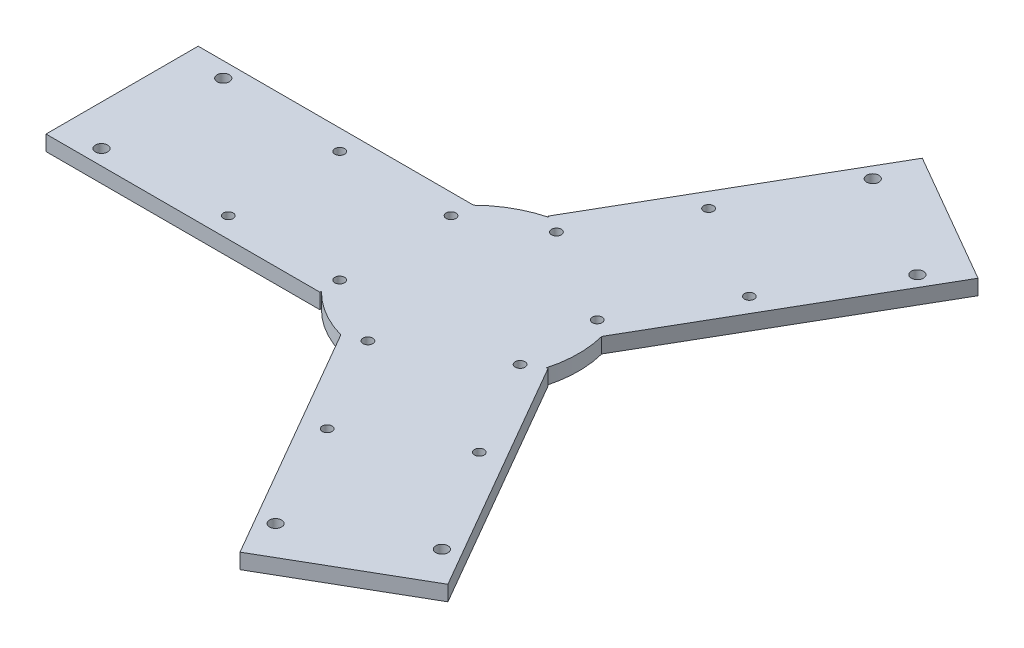
ISO-10303-21;
HEADER;
FILE_DESCRIPTION(('STEP AP214'),'2;1');
FILE_NAME('part.step','',(''),(''),'','','');
FILE_SCHEMA(('AUTOMOTIVE_DESIGN { 1 0 10303 214 1 1 1 1 }'));
ENDSEC;
DATA;
#1=APPLICATION_CONTEXT('core data for automotive mechanical design processes');
#2=APPLICATION_PROTOCOL_DEFINITION('international standard','automotive_design',2000,#1);
#3=PRODUCT_CONTEXT('',#1,'mechanical');
#4=PRODUCT('Part','Part','',(#3));
#5=PRODUCT_RELATED_PRODUCT_CATEGORY('part','',(#4));
#6=PRODUCT_DEFINITION_FORMATION('','',#4);
#7=PRODUCT_DEFINITION_CONTEXT('part definition',#1,'design');
#8=PRODUCT_DEFINITION('design','',#6,#7);
#9=PRODUCT_DEFINITION_SHAPE('','',#8);
#10=(LENGTH_UNIT() NAMED_UNIT(*) SI_UNIT(.MILLI.,.METRE.));
#11=(NAMED_UNIT(*) PLANE_ANGLE_UNIT() SI_UNIT($,.RADIAN.));
#12=(NAMED_UNIT(*) SI_UNIT($,.STERADIAN.) SOLID_ANGLE_UNIT());
#13=UNCERTAINTY_MEASURE_WITH_UNIT(LENGTH_MEASURE(1.E-05),#10,'distance_accuracy_value','');
#14=(GEOMETRIC_REPRESENTATION_CONTEXT(3) GLOBAL_UNCERTAINTY_ASSIGNED_CONTEXT((#13)) GLOBAL_UNIT_ASSIGNED_CONTEXT((#10,
#11,#12)) REPRESENTATION_CONTEXT('',''));
#15=CARTESIAN_POINT('',(0.,0.,0.));
#16=DIRECTION('',(0.,0.,1.));
#17=DIRECTION('',(1.,0.,0.));
#18=AXIS2_PLACEMENT_3D('',#15,#16,#17);
#19=CARTESIAN_POINT('',(0.,5.,-24.9999999999607));
#20=DIRECTION('',(0.,0.,-1.));
#21=DIRECTION('',(-1.,0.,0.));
#22=AXIS2_PLACEMENT_3D('',#19,#20,#21);
#23=PLANE('',#22);
#24=DIRECTION('',(1.,0.,0.));
#25=VECTOR('',#24,1.);
#26=CARTESIAN_POINT('',(0.,0.,-24.9999999999607));
#27=LINE('',#26,#25);
#28=CARTESIAN_POINT('',(-115.,0.,-24.9999999999607));
#29=VERTEX_POINT('',#28);
#30=CARTESIAN_POINT('',(-24.4948974278719,0.,-24.9999999999607));
#31=VERTEX_POINT('',#30);
#32=EDGE_CURVE('E313',#29,#31,#27,.T.);
#33=ORIENTED_EDGE('',*,*,#32,.F.);
#34=DIRECTION('',(0.,-1.,0.));
#35=VECTOR('',#34,1.);
#36=CARTESIAN_POINT('',(-115.,5.,-24.9999999999607));
#37=LINE('',#36,#35);
#38=CARTESIAN_POINT('',(-115.,5.,-24.9999999999607));
#39=VERTEX_POINT('',#38);
#40=EDGE_CURVE('E198',#39,#29,#37,.T.);
#41=ORIENTED_EDGE('',*,*,#40,.F.);
#42=DIRECTION('',(1.,0.,0.));
#43=VECTOR('',#42,1.);
#44=CARTESIAN_POINT('',(0.,5.,-24.9999999999607));
#45=LINE('',#44,#43);
#46=CARTESIAN_POINT('',(-24.4948974278719,5.,-24.9999999999607));
#47=VERTEX_POINT('',#46);
#48=EDGE_CURVE('E341',#39,#47,#45,.T.);
#49=ORIENTED_EDGE('',*,*,#48,.T.);
#50=DIRECTION('',(0.,-1.,0.));
#51=VECTOR('',#50,1.);
#52=CARTESIAN_POINT('',(-24.4948974278719,5.,-24.9999999999607));
#53=LINE('',#52,#51);
#54=EDGE_CURVE('E12',#47,#31,#53,.T.);
#55=ORIENTED_EDGE('',*,*,#54,.T.);
#56=EDGE_LOOP('',(#33,#41,#49,#55));
#57=FACE_BOUND('',#56,.T.);
#58=ADVANCED_FACE('F188',(#57),#23,.T.);
#59=CARTESIAN_POINT('',(-115.,5.,0.));
#60=DIRECTION('',(-1.,0.,0.));
#61=DIRECTION('',(0.,0.,1.));
#62=AXIS2_PLACEMENT_3D('',#59,#60,#61);
#63=PLANE('',#62);
#64=DIRECTION('',(0.,0.,-1.));
#65=VECTOR('',#64,1.);
#66=CARTESIAN_POINT('',(-115.,0.,0.));
#67=LINE('',#66,#65);
#68=CARTESIAN_POINT('',(-115.,0.,25.000000000055));
#69=VERTEX_POINT('',#68);
#70=EDGE_CURVE('E354',#69,#29,#67,.T.);
#71=ORIENTED_EDGE('',*,*,#70,.F.);
#72=DIRECTION('',(0.,-1.,0.));
#73=VECTOR('',#72,1.);
#74=CARTESIAN_POINT('',(-115.,5.,25.000000000055));
#75=LINE('',#74,#73);
#76=CARTESIAN_POINT('',(-115.,5.,25.000000000055));
#77=VERTEX_POINT('',#76);
#78=EDGE_CURVE('E365',#77,#69,#75,.T.);
#79=ORIENTED_EDGE('',*,*,#78,.F.);
#80=DIRECTION('',(0.,0.,-1.));
#81=VECTOR('',#80,1.);
#82=CARTESIAN_POINT('',(-115.,5.,0.));
#83=LINE('',#82,#81);
#84=EDGE_CURVE('E344',#77,#39,#83,.T.);
#85=ORIENTED_EDGE('',*,*,#84,.T.);
#86=ORIENTED_EDGE('',*,*,#40,.T.);
#87=EDGE_LOOP('',(#71,#79,#85,#86));
#88=FACE_BOUND('',#87,.T.);
#89=ADVANCED_FACE('F460',(#88),#63,.T.);
#90=CARTESIAN_POINT('',(0.,5.,25.000000000055));
#91=DIRECTION('',(0.,0.,1.));
#92=DIRECTION('',(1.,0.,0.));
#93=AXIS2_PLACEMENT_3D('',#90,#91,#92);
#94=PLANE('',#93);
#95=DIRECTION('',(-1.,0.,0.));
#96=VECTOR('',#95,1.);
#97=CARTESIAN_POINT('',(0.,0.,25.000000000055));
#98=LINE('',#97,#96);
#99=CARTESIAN_POINT('',(-25.,0.,25.000000000055));
#100=VERTEX_POINT('',#99);
#101=EDGE_CURVE('E357',#100,#69,#98,.T.);
#102=ORIENTED_EDGE('',*,*,#101,.F.);
#103=DIRECTION('',(0.,-1.,0.));
#104=VECTOR('',#103,1.);
#105=CARTESIAN_POINT('',(-25.,5.,25.000000000055));
#106=LINE('',#105,#104);
#107=CARTESIAN_POINT('',(-25.,5.,25.000000000055));
#108=VERTEX_POINT('',#107);
#109=EDGE_CURVE('E363',#108,#100,#106,.T.);
#110=ORIENTED_EDGE('',*,*,#109,.F.);
#111=DIRECTION('',(-1.,0.,0.));
#112=VECTOR('',#111,1.);
#113=CARTESIAN_POINT('',(0.,5.,25.000000000055));
#114=LINE('',#113,#112);
#115=EDGE_CURVE('E348',#108,#77,#114,.T.);
#116=ORIENTED_EDGE('',*,*,#115,.T.);
#117=ORIENTED_EDGE('',*,*,#78,.T.);
#118=EDGE_LOOP('',(#102,#110,#116,#117));
#119=FACE_BOUND('',#118,.T.);
#120=ADVANCED_FACE('F456',(#119),#94,.T.);
#121=CARTESIAN_POINT('',(-24.744923458781,5.,-0.249974489722791));
#122=DIRECTION('',(0.99994897818343,0.,0.0101015360175433));
#123=DIRECTION('',(0.0101015360175433,0.,-0.99994897818343));
#124=AXIS2_PLACEMENT_3D('',#121,#122,#123);
#125=PLANE('',#124);
#126=DIRECTION('',(-0.0101015360175433,0.,0.99994897818343));
#127=VECTOR('',#126,1.);
#128=CARTESIAN_POINT('',(-24.744923458781,0.,-0.249974489722791));
#129=LINE('',#128,#127);
#130=CARTESIAN_POINT('',(-24.9949494896901,0.,24.5000510205151));
#131=VERTEX_POINT('',#130);
#132=EDGE_CURVE('E345',#131,#100,#129,.T.);
#133=ORIENTED_EDGE('',*,*,#132,.F.);
#134=DIRECTION('',(0.,-1.,0.));
#135=VECTOR('',#134,1.);
#136=CARTESIAN_POINT('',(-24.9949494896901,5.,24.5000510205151));
#137=LINE('',#136,#135);
#138=CARTESIAN_POINT('',(-24.9949494896901,5.,24.5000510205151));
#139=VERTEX_POINT('',#138);
#140=EDGE_CURVE('E207',#139,#131,#137,.T.);
#141=ORIENTED_EDGE('',*,*,#140,.F.);
#142=DIRECTION('',(-0.0101015360175433,0.,0.99994897818343));
#143=VECTOR('',#142,1.);
#144=CARTESIAN_POINT('',(-24.744923458781,5.,-0.249974489722791));
#145=LINE('',#144,#143);
#146=EDGE_CURVE('E351',#139,#108,#145,.T.);
#147=ORIENTED_EDGE('',*,*,#146,.T.);
#148=ORIENTED_EDGE('',*,*,#109,.T.);
#149=EDGE_LOOP('',(#133,#141,#147,#148));
#150=FACE_BOUND('',#149,.T.);
#151=ADVANCED_FACE('F453',(#150),#125,.T.);
#152=CARTESIAN_POINT('',(0.,0.,0.));
#153=DIRECTION('',(0.,1.,0.));
#154=DIRECTION('',(0.,0.,1.));
#155=AXIS2_PLACEMENT_3D('',#152,#153,#154);
#156=PLANE('',#155);
#157=CARTESIAN_POINT('',(-25.2,0.,18.3000000000471));
#158=DIRECTION('',(0.,1.,0.));
#159=DIRECTION('',(0.,0.,1.));
#160=AXIS2_PLACEMENT_3D('',#157,#158,#159);
#161=CIRCLE('',#160,1.6);
#162=CARTESIAN_POINT('',(-25.2,0.,19.9000000000471));
#163=VERTEX_POINT('',#162);
#164=EDGE_CURVE('E778',#163,#163,#161,.T.);
#165=ORIENTED_EDGE('',*,*,#164,.T.);
#166=EDGE_LOOP('',(#165));
#167=FACE_BOUND('',#166,.T.);
#168=CARTESIAN_POINT('',(-61.8,0.,18.3000000000471));
#169=DIRECTION('',(0.,1.,0.));
#170=DIRECTION('',(0.,0.,1.));
#171=AXIS2_PLACEMENT_3D('',#168,#169,#170);
#172=CIRCLE('',#171,1.6);
#173=CARTESIAN_POINT('',(-61.8,0.,19.9000000000471));
#174=VERTEX_POINT('',#173);
#175=EDGE_CURVE('E891',#174,#174,#172,.T.);
#176=ORIENTED_EDGE('',*,*,#175,.T.);
#177=EDGE_LOOP('',(#176));
#178=FACE_BOUND('',#177,.T.);
#179=CARTESIAN_POINT('',(-25.2,0.,-18.2999999999529));
#180=DIRECTION('',(0.,1.,0.));
#181=DIRECTION('',(0.,0.,1.));
#182=AXIS2_PLACEMENT_3D('',#179,#180,#181);
#183=CIRCLE('',#182,1.6);
#184=CARTESIAN_POINT('',(-25.2,0.,-16.6999999999529));
#185=VERTEX_POINT('',#184);
#186=EDGE_CURVE('E885',#185,#185,#183,.T.);
#187=ORIENTED_EDGE('',*,*,#186,.T.);
#188=EDGE_LOOP('',(#187));
#189=FACE_BOUND('',#188,.T.);
#190=CARTESIAN_POINT('',(-3.24826488929598,0.,-30.9738401753916));
#191=DIRECTION('',(0.,1.,0.));
#192=DIRECTION('',(0.,0.,1.));
#193=AXIS2_PLACEMENT_3D('',#190,#191,#192);
#194=CIRCLE('',#193,1.6);
#195=CARTESIAN_POINT('',(-3.24826488929598,0.,-29.3738401753916));
#196=VERTEX_POINT('',#195);
#197=EDGE_CURVE('E879',#196,#196,#194,.T.);
#198=ORIENTED_EDGE('',*,*,#197,.T.);
#199=EDGE_LOOP('',(#198));
#200=FACE_BOUND('',#199,.T.);
#201=CARTESIAN_POINT('',(15.051735110704,0.,-62.6703699539021));
#202=DIRECTION('',(0.,1.,0.));
#203=DIRECTION('',(0.,0.,1.));
#204=AXIS2_PLACEMENT_3D('',#201,#202,#203);
#205=CIRCLE('',#204,1.6);
#206=CARTESIAN_POINT('',(15.051735110704,0.,-61.0703699539021));
#207=VERTEX_POINT('',#206);
#208=EDGE_CURVE('E873',#207,#207,#205,.T.);
#209=ORIENTED_EDGE('',*,*,#208,.T.);
#210=EDGE_LOOP('',(#209));
#211=FACE_BOUND('',#210,.T.);
#212=CARTESIAN_POINT('',(46.7482648892145,0.,-44.3703699539021));
#213=DIRECTION('',(0.,1.,0.));
#214=DIRECTION('',(0.,0.,1.));
#215=AXIS2_PLACEMENT_3D('',#212,#213,#214);
#216=CIRCLE('',#215,1.6);
#217=CARTESIAN_POINT('',(46.7482648892145,0.,-42.7703699539021));
#218=VERTEX_POINT('',#217);
#219=EDGE_CURVE('E867',#218,#218,#216,.T.);
#220=ORIENTED_EDGE('',*,*,#219,.T.);
#221=EDGE_LOOP('',(#220));
#222=FACE_BOUND('',#221,.T.);
#223=CARTESIAN_POINT('',(28.4482648892145,0.,-12.6738401753916));
#224=DIRECTION('',(0.,1.,0.));
#225=DIRECTION('',(0.,0.,1.));
#226=AXIS2_PLACEMENT_3D('',#223,#224,#225);
#227=CIRCLE('',#226,1.6);
#228=CARTESIAN_POINT('',(28.4482648892145,0.,-11.0738401753916));
#229=VERTEX_POINT('',#228);
#230=EDGE_CURVE('E861',#229,#229,#227,.T.);
#231=ORIENTED_EDGE('',*,*,#230,.T.);
#232=EDGE_LOOP('',(#231));
#233=FACE_BOUND('',#232,.T.);
#234=CARTESIAN_POINT('',(46.748264889296,0.,44.3703699538548));
#235=DIRECTION('',(0.,1.,0.));
#236=DIRECTION('',(0.,0.,1.));
#237=AXIS2_PLACEMENT_3D('',#234,#235,#236);
#238=CIRCLE('',#237,1.6);
#239=CARTESIAN_POINT('',(46.748264889296,0.,45.9703699538548));
#240=VERTEX_POINT('',#239);
#241=EDGE_CURVE('E804',#240,#240,#238,.T.);
#242=ORIENTED_EDGE('',*,*,#241,.T.);
#243=EDGE_LOOP('',(#242));
#244=FACE_BOUND('',#243,.T.);
#245=CARTESIAN_POINT('',(-101.75,0.,20.000000000055));
#246=DIRECTION('',(0.,1.,0.));
#247=DIRECTION('',(0.,0.,1.));
#248=AXIS2_PLACEMENT_3D('',#245,#246,#247);
#249=CIRCLE('',#248,2.);
#250=CARTESIAN_POINT('',(-101.75,0.,22.000000000055));
#251=VERTEX_POINT('',#250);
#252=EDGE_CURVE('E335',#251,#251,#249,.T.);
#253=ORIENTED_EDGE('',*,*,#252,.T.);
#254=EDGE_LOOP('',(#253));
#255=FACE_BOUND('',#254,.T.);
#256=CARTESIAN_POINT('',(33.5544919243453,0.,98.1180848350469));
#257=DIRECTION('',(0.,1.,0.));
#258=DIRECTION('',(0.,0.,1.));
#259=AXIS2_PLACEMENT_3D('',#256,#257,#258);
#260=CIRCLE('',#259,2.);
#261=CARTESIAN_POINT('',(33.5544919243453,0.,100.118084835047));
#262=VERTEX_POINT('',#261);
#263=EDGE_CURVE('E821',#262,#262,#260,.T.);
#264=ORIENTED_EDGE('',*,*,#263,.T.);
#265=EDGE_LOOP('',(#264));
#266=FACE_BOUND('',#265,.T.);
#267=CARTESIAN_POINT('',(68.1955080757365,0.,78.1180848350391));
#268=DIRECTION('',(0.,1.,0.));
#269=DIRECTION('',(0.,0.,1.));
#270=AXIS2_PLACEMENT_3D('',#267,#268,#269);
#271=CIRCLE('',#270,2.);
#272=CARTESIAN_POINT('',(68.1955080757365,0.,80.1180848350391));
#273=VERTEX_POINT('',#272);
#274=EDGE_CURVE('E827',#273,#273,#271,.T.);
#275=ORIENTED_EDGE('',*,*,#274,.T.);
#276=EDGE_LOOP('',(#275));
#277=FACE_BOUND('',#276,.T.);
#278=CARTESIAN_POINT('',(68.1955080756547,0.,-78.1180848350863));
#279=DIRECTION('',(0.,1.,0.));
#280=DIRECTION('',(0.,0.,1.));
#281=AXIS2_PLACEMENT_3D('',#278,#279,#280);
#282=CIRCLE('',#281,2.00000000000001);
#283=CARTESIAN_POINT('',(68.1955080756547,0.,-76.1180848350863));
#284=VERTEX_POINT('',#283);
#285=EDGE_CURVE('E832',#284,#284,#282,.T.);
#286=ORIENTED_EDGE('',*,*,#285,.T.);
#287=EDGE_LOOP('',(#286));
#288=FACE_BOUND('',#287,.T.);
#289=CARTESIAN_POINT('',(28.448264889296,0.,12.6738401753444));
#290=DIRECTION('',(0.,1.,0.));
#291=DIRECTION('',(0.,0.,1.));
#292=AXIS2_PLACEMENT_3D('',#289,#290,#291);
#293=CIRCLE('',#292,1.6);
#294=CARTESIAN_POINT('',(28.448264889296,0.,14.2738401753444));
#295=VERTEX_POINT('',#294);
#296=EDGE_CURVE('E798',#295,#295,#293,.T.);
#297=ORIENTED_EDGE('',*,*,#296,.T.);
#298=EDGE_LOOP('',(#297));
#299=FACE_BOUND('',#298,.T.);
#300=CARTESIAN_POINT('',(15.0517351107856,0.,62.6703699538548));
#301=DIRECTION('',(0.,1.,0.));
#302=DIRECTION('',(0.,0.,1.));
#303=AXIS2_PLACEMENT_3D('',#300,#301,#302);
#304=CIRCLE('',#303,1.60000000000001);
#305=CARTESIAN_POINT('',(15.0517351107856,0.,64.2703699538549));
#306=VERTEX_POINT('',#305);
#307=EDGE_CURVE('E791',#306,#306,#304,.T.);
#308=ORIENTED_EDGE('',*,*,#307,.T.);
#309=EDGE_LOOP('',(#308));
#310=FACE_BOUND('',#309,.T.);
#311=CARTESIAN_POINT('',(-3.24826488921442,0.,30.9738401753444));
#312=DIRECTION('',(0.,1.,0.));
#313=DIRECTION('',(0.,0.,1.));
#314=AXIS2_PLACEMENT_3D('',#311,#312,#313);
#315=CIRCLE('',#314,1.6);
#316=CARTESIAN_POINT('',(-3.24826488921442,0.,32.5738401753444));
#317=VERTEX_POINT('',#316);
#318=EDGE_CURVE('E811',#317,#317,#315,.T.);
#319=ORIENTED_EDGE('',*,*,#318,.T.);
#320=EDGE_LOOP('',(#319));
#321=FACE_BOUND('',#320,.T.);
#322=CARTESIAN_POINT('',(33.5544919242636,0.,-98.1180848350942));
#323=DIRECTION('',(0.,1.,0.));
#324=DIRECTION('',(0.,0.,1.));
#325=AXIS2_PLACEMENT_3D('',#322,#323,#324);
#326=CIRCLE('',#325,2.00000000000001);
#327=CARTESIAN_POINT('',(33.5544919242636,0.,-96.1180848350942));
#328=VERTEX_POINT('',#327);
#329=EDGE_CURVE('E805',#328,#328,#326,.T.);
#330=ORIENTED_EDGE('',*,*,#329,.T.);
#331=EDGE_LOOP('',(#330));
#332=FACE_BOUND('',#331,.T.);
#333=CARTESIAN_POINT('',(-61.8,0.,-18.2999999999529));
#334=DIRECTION('',(0.,1.,0.));
#335=DIRECTION('',(0.,0.,1.));
#336=AXIS2_PLACEMENT_3D('',#333,#334,#335);
#337=CIRCLE('',#336,1.6);
#338=CARTESIAN_POINT('',(-61.8,0.,-16.6999999999529));
#339=VERTEX_POINT('',#338);
#340=EDGE_CURVE('E782',#339,#339,#337,.T.);
#341=ORIENTED_EDGE('',*,*,#340,.T.);
#342=EDGE_LOOP('',(#341));
#343=FACE_BOUND('',#342,.T.);
#344=CARTESIAN_POINT('',(-101.75,0.,-19.9999999999606));
#345=DIRECTION('',(0.,1.,0.));
#346=DIRECTION('',(0.,0.,1.));
#347=AXIS2_PLACEMENT_3D('',#344,#345,#346);
#348=CIRCLE('',#347,2.);
#349=CARTESIAN_POINT('',(-101.75,0.,-17.9999999999606));
#350=VERTEX_POINT('',#349);
#351=EDGE_CURVE('E323',#350,#350,#348,.T.);
#352=ORIENTED_EDGE('',*,*,#351,.T.);
#353=EDGE_LOOP('',(#352));
#354=FACE_BOUND('',#353,.T.);
#355=ORIENTED_EDGE('',*,*,#32,.T.);
#356=CARTESIAN_POINT('',(0.,0.,0.));
#357=DIRECTION('',(0.,1.,0.));
#358=DIRECTION('',(0.,0.,1.));
#359=AXIS2_PLACEMENT_3D('',#356,#357,#358);
#360=CIRCLE('',#359,35.);
#361=CARTESIAN_POINT('',(-8.72019183293593,0.,-33.896286734638));
#362=VERTEX_POINT('',#361);
#363=EDGE_CURVE('E296',#362,#31,#360,.T.);
#364=ORIENTED_EDGE('',*,*,#363,.F.);
#365=DIRECTION('',(0.86093044958637,0.,0.508722675900151));
#366=VECTOR('',#365,1.);
#367=CARTESIAN_POINT('',(12.5889459877885,0.,-21.3047450851444));
#368=LINE('',#367,#366);
#369=CARTESIAN_POINT('',(-9.15063509465858,0.,-34.1506350946385));
#370=VERTEX_POINT('',#369);
#371=EDGE_CURVE('E303',#370,#362,#368,.T.);
#372=ORIENTED_EDGE('',*,*,#371,.F.);
#373=DIRECTION('',(0.5,0.,-0.866025403784439));
#374=VECTOR('',#373,1.);
#375=CARTESIAN_POINT('',(-21.6506350946586,0.,-12.5000000000275));
#376=LINE('',#375,#374);
#377=CARTESIAN_POINT('',(35.8493649053414,0.,-112.092921435238));
#378=VERTEX_POINT('',#377);
#379=EDGE_CURVE('E308',#370,#378,#376,.T.);
#380=ORIENTED_EDGE('',*,*,#379,.T.);
#381=DIRECTION('',(0.866025403784439,0.,0.5));
#382=VECTOR('',#381,1.);
#383=CARTESIAN_POINT('',(57.5,0.,-99.5929214352105));
#384=LINE('',#383,#382);
#385=CARTESIAN_POINT('',(79.1506350945769,0.,-87.0929214352301));
#386=VERTEX_POINT('',#385);
#387=EDGE_CURVE('E328',#378,#386,#384,.T.);
#388=ORIENTED_EDGE('',*,*,#387,.T.);
#389=DIRECTION('',(0.5,0.,-0.866025403784439));
#390=VECTOR('',#389,1.);
#391=CARTESIAN_POINT('',(21.6506350945769,0.,12.4999999999803));
#392=LINE('',#391,#390);
#393=CARTESIAN_POINT('',(33.8980838085129,0.,-8.71320343565085));
#394=VERTEX_POINT('',#393);
#395=EDGE_CURVE('E322',#394,#386,#392,.T.);
#396=ORIENTED_EDGE('',*,*,#395,.F.);
#397=CARTESIAN_POINT('',(33.715141322626,0.,9.39623571412291));
#398=VERTEX_POINT('',#397);
#399=EDGE_CURVE('E316',#398,#394,#360,.T.);
#400=ORIENTED_EDGE('',*,*,#399,.F.);
#401=DIRECTION('',(0.871031985603914,0.,-0.49122630228328));
#402=VECTOR('',#401,1.);
#403=CARTESIAN_POINT('',(12.1559774709925,0.,21.5547195748672));
#404=LINE('',#403,#402);
#405=CARTESIAN_POINT('',(34.1506350946586,0.,9.15063509458348));
#406=VERTEX_POINT('',#405);
#407=EDGE_CURVE('E371',#398,#406,#404,.T.);
#408=ORIENTED_EDGE('',*,*,#407,.T.);
#409=DIRECTION('',(0.500000000000001,0.,0.866025403784438));
#410=VECTOR('',#409,1.);
#411=CARTESIAN_POINT('',(21.6506350946586,0.,-12.5000000000275));
#412=LINE('',#411,#410);
#413=CARTESIAN_POINT('',(79.1506350946587,0.,87.0929214351829));
#414=VERTEX_POINT('',#413);
#415=EDGE_CURVE('E387',#406,#414,#412,.T.);
#416=ORIENTED_EDGE('',*,*,#415,.T.);
#417=DIRECTION('',(-0.866025403784438,0.,0.5));
#418=VECTOR('',#417,1.);
#419=CARTESIAN_POINT('',(57.5000000000001,0.,99.5929214352104));
#420=LINE('',#419,#418);
#421=CARTESIAN_POINT('',(35.8493649054231,0.,112.092921435191));
#422=VERTEX_POINT('',#421);
#423=EDGE_CURVE('E384',#414,#422,#420,.T.);
#424=ORIENTED_EDGE('',*,*,#423,.T.);
#425=DIRECTION('',(0.5,0.,0.866025403784438));
#426=VECTOR('',#425,1.);
#427=CARTESIAN_POINT('',(-21.6506350945769,0.,12.4999999999803));
#428=LINE('',#427,#426);
#429=CARTESIAN_POINT('',(-9.40318638064095,0.,33.7132034356115));
#430=VERTEX_POINT('',#429);
#431=EDGE_CURVE('E381',#430,#422,#428,.T.);
#432=ORIENTED_EDGE('',*,*,#431,.F.);
#433=EDGE_CURVE('E314',#131,#430,#360,.T.);
#434=ORIENTED_EDGE('',*,*,#433,.F.);
#435=ORIENTED_EDGE('',*,*,#132,.T.);
#436=ORIENTED_EDGE('',*,*,#101,.T.);
#437=ORIENTED_EDGE('',*,*,#70,.T.);
#438=EDGE_LOOP('',(#355,#364,#372,#380,#388,#396,#400,#408,#416,#424,#432,#434,#435,#436,#437));
#439=FACE_BOUND('',#438,.T.);
#440=ADVANCED_FACE('F310',(#167,#178,#189,#200,#211,#222,#233,#244,#255,#266,#277,#288,#299,
#310,#321,#332,#343,#354,#439),#156,.F.);
#441=CARTESIAN_POINT('',(0.,5.,0.));
#442=DIRECTION('',(0.,1.,0.));
#443=DIRECTION('',(0.,0.,1.));
#444=AXIS2_PLACEMENT_3D('',#441,#442,#443);
#445=PLANE('',#444);
#446=CARTESIAN_POINT('',(-25.2,5.,18.3000000000471));
#447=DIRECTION('',(0.,1.,0.));
#448=DIRECTION('',(0.,0.,1.));
#449=AXIS2_PLACEMENT_3D('',#446,#447,#448);
#450=CIRCLE('',#449,1.6);
#451=CARTESIAN_POINT('',(-25.2,5.,19.9000000000471));
#452=VERTEX_POINT('',#451);
#453=EDGE_CURVE('E781',#452,#452,#450,.T.);
#454=ORIENTED_EDGE('',*,*,#453,.F.);
#455=EDGE_LOOP('',(#454));
#456=FACE_BOUND('',#455,.T.);
#457=CARTESIAN_POINT('',(-61.8,5.,18.3000000000471));
#458=DIRECTION('',(0.,1.,0.));
#459=DIRECTION('',(0.,0.,1.));
#460=AXIS2_PLACEMENT_3D('',#457,#458,#459);
#461=CIRCLE('',#460,1.6);
#462=CARTESIAN_POINT('',(-61.8,5.,19.9000000000471));
#463=VERTEX_POINT('',#462);
#464=EDGE_CURVE('E784',#463,#463,#461,.T.);
#465=ORIENTED_EDGE('',*,*,#464,.F.);
#466=EDGE_LOOP('',(#465));
#467=FACE_BOUND('',#466,.T.);
#468=CARTESIAN_POINT('',(-25.2,5.,-18.2999999999529));
#469=DIRECTION('',(0.,1.,0.));
#470=DIRECTION('',(0.,0.,1.));
#471=AXIS2_PLACEMENT_3D('',#468,#469,#470);
#472=CIRCLE('',#471,1.6);
#473=CARTESIAN_POINT('',(-25.2,5.,-16.6999999999529));
#474=VERTEX_POINT('',#473);
#475=EDGE_CURVE('E888',#474,#474,#472,.T.);
#476=ORIENTED_EDGE('',*,*,#475,.F.);
#477=EDGE_LOOP('',(#476));
#478=FACE_BOUND('',#477,.T.);
#479=CARTESIAN_POINT('',(-3.24826488929598,5.,-30.9738401753916));
#480=DIRECTION('',(0.,1.,0.));
#481=DIRECTION('',(0.,0.,1.));
#482=AXIS2_PLACEMENT_3D('',#479,#480,#481);
#483=CIRCLE('',#482,1.6);
#484=CARTESIAN_POINT('',(-3.24826488929598,5.,-29.3738401753916));
#485=VERTEX_POINT('',#484);
#486=EDGE_CURVE('E882',#485,#485,#483,.T.);
#487=ORIENTED_EDGE('',*,*,#486,.F.);
#488=EDGE_LOOP('',(#487));
#489=FACE_BOUND('',#488,.T.);
#490=CARTESIAN_POINT('',(15.051735110704,5.,-62.6703699539021));
#491=DIRECTION('',(0.,1.,0.));
#492=DIRECTION('',(0.,0.,1.));
#493=AXIS2_PLACEMENT_3D('',#490,#491,#492);
#494=CIRCLE('',#493,1.6);
#495=CARTESIAN_POINT('',(15.051735110704,5.,-61.0703699539021));
#496=VERTEX_POINT('',#495);
#497=EDGE_CURVE('E876',#496,#496,#494,.T.);
#498=ORIENTED_EDGE('',*,*,#497,.F.);
#499=EDGE_LOOP('',(#498));
#500=FACE_BOUND('',#499,.T.);
#501=CARTESIAN_POINT('',(46.7482648892145,5.,-44.3703699539021));
#502=DIRECTION('',(0.,1.,0.));
#503=DIRECTION('',(0.,0.,1.));
#504=AXIS2_PLACEMENT_3D('',#501,#502,#503);
#505=CIRCLE('',#504,1.6);
#506=CARTESIAN_POINT('',(46.7482648892145,5.,-42.7703699539021));
#507=VERTEX_POINT('',#506);
#508=EDGE_CURVE('E870',#507,#507,#505,.T.);
#509=ORIENTED_EDGE('',*,*,#508,.F.);
#510=EDGE_LOOP('',(#509));
#511=FACE_BOUND('',#510,.T.);
#512=CARTESIAN_POINT('',(28.4482648892145,5.,-12.6738401753916));
#513=DIRECTION('',(0.,1.,0.));
#514=DIRECTION('',(0.,0.,1.));
#515=AXIS2_PLACEMENT_3D('',#512,#513,#514);
#516=CIRCLE('',#515,1.6);
#517=CARTESIAN_POINT('',(28.4482648892145,5.,-11.0738401753916));
#518=VERTEX_POINT('',#517);
#519=EDGE_CURVE('E864',#518,#518,#516,.T.);
#520=ORIENTED_EDGE('',*,*,#519,.F.);
#521=EDGE_LOOP('',(#520));
#522=FACE_BOUND('',#521,.T.);
#523=CARTESIAN_POINT('',(46.748264889296,5.,44.3703699538548));
#524=DIRECTION('',(0.,1.,0.));
#525=DIRECTION('',(0.,0.,1.));
#526=AXIS2_PLACEMENT_3D('',#523,#524,#525);
#527=CIRCLE('',#526,1.6);
#528=CARTESIAN_POINT('',(46.748264889296,5.,45.9703699538548));
#529=VERTEX_POINT('',#528);
#530=EDGE_CURVE('E858',#529,#529,#527,.T.);
#531=ORIENTED_EDGE('',*,*,#530,.F.);
#532=EDGE_LOOP('',(#531));
#533=FACE_BOUND('',#532,.T.);
#534=CARTESIAN_POINT('',(-101.75,5.,20.000000000055));
#535=DIRECTION('',(0.,1.,0.));
#536=DIRECTION('',(0.,0.,1.));
#537=AXIS2_PLACEMENT_3D('',#534,#535,#536);
#538=CIRCLE('',#537,2.);
#539=CARTESIAN_POINT('',(-101.75,5.,22.000000000055));
#540=VERTEX_POINT('',#539);
#541=EDGE_CURVE('E818',#540,#540,#538,.T.);
#542=ORIENTED_EDGE('',*,*,#541,.F.);
#543=EDGE_LOOP('',(#542));
#544=FACE_BOUND('',#543,.T.);
#545=CARTESIAN_POINT('',(33.5544919243453,5.,98.1180848350469));
#546=DIRECTION('',(0.,1.,0.));
#547=DIRECTION('',(0.,0.,1.));
#548=AXIS2_PLACEMENT_3D('',#545,#546,#547);
#549=CIRCLE('',#548,2.);
#550=CARTESIAN_POINT('',(33.5544919243453,5.,100.118084835047));
#551=VERTEX_POINT('',#550);
#552=EDGE_CURVE('E824',#551,#551,#549,.T.);
#553=ORIENTED_EDGE('',*,*,#552,.F.);
#554=EDGE_LOOP('',(#553));
#555=FACE_BOUND('',#554,.T.);
#556=CARTESIAN_POINT('',(68.1955080757365,5.,78.1180848350391));
#557=DIRECTION('',(0.,1.,0.));
#558=DIRECTION('',(0.,0.,1.));
#559=AXIS2_PLACEMENT_3D('',#556,#557,#558);
#560=CIRCLE('',#559,2.);
#561=CARTESIAN_POINT('',(68.1955080757365,5.,80.1180848350391));
#562=VERTEX_POINT('',#561);
#563=EDGE_CURVE('E830',#562,#562,#560,.T.);
#564=ORIENTED_EDGE('',*,*,#563,.F.);
#565=EDGE_LOOP('',(#564));
#566=FACE_BOUND('',#565,.T.);
#567=CARTESIAN_POINT('',(68.1955080756547,5.,-78.1180848350863));
#568=DIRECTION('',(0.,1.,0.));
#569=DIRECTION('',(0.,0.,1.));
#570=AXIS2_PLACEMENT_3D('',#567,#568,#569);
#571=CIRCLE('',#570,2.00000000000001);
#572=CARTESIAN_POINT('',(68.1955080756547,5.,-76.1180848350863));
#573=VERTEX_POINT('',#572);
#574=EDGE_CURVE('E338',#573,#573,#571,.T.);
#575=ORIENTED_EDGE('',*,*,#574,.F.);
#576=EDGE_LOOP('',(#575));
#577=FACE_BOUND('',#576,.T.);
#578=CARTESIAN_POINT('',(28.448264889296,5.,12.6738401753444));
#579=DIRECTION('',(0.,1.,0.));
#580=DIRECTION('',(0.,0.,1.));
#581=AXIS2_PLACEMENT_3D('',#578,#579,#580);
#582=CIRCLE('',#581,1.6);
#583=CARTESIAN_POINT('',(28.448264889296,5.,14.2738401753444));
#584=VERTEX_POINT('',#583);
#585=EDGE_CURVE('E801',#584,#584,#582,.T.);
#586=ORIENTED_EDGE('',*,*,#585,.F.);
#587=EDGE_LOOP('',(#586));
#588=FACE_BOUND('',#587,.T.);
#589=CARTESIAN_POINT('',(15.0517351107856,5.,62.6703699538548));
#590=DIRECTION('',(0.,1.,0.));
#591=DIRECTION('',(0.,0.,1.));
#592=AXIS2_PLACEMENT_3D('',#589,#590,#591);
#593=CIRCLE('',#592,1.60000000000001);
#594=CARTESIAN_POINT('',(15.0517351107856,5.,64.2703699538549));
#595=VERTEX_POINT('',#594);
#596=EDGE_CURVE('E795',#595,#595,#593,.T.);
#597=ORIENTED_EDGE('',*,*,#596,.F.);
#598=EDGE_LOOP('',(#597));
#599=FACE_BOUND('',#598,.T.);
#600=CARTESIAN_POINT('',(-3.24826488921442,5.,30.9738401753444));
#601=DIRECTION('',(0.,1.,0.));
#602=DIRECTION('',(0.,0.,1.));
#603=AXIS2_PLACEMENT_3D('',#600,#601,#602);
#604=CIRCLE('',#603,1.6);
#605=CARTESIAN_POINT('',(-3.24826488921442,5.,32.5738401753444));
#606=VERTEX_POINT('',#605);
#607=EDGE_CURVE('E794',#606,#606,#604,.T.);
#608=ORIENTED_EDGE('',*,*,#607,.F.);
#609=EDGE_LOOP('',(#608));
#610=FACE_BOUND('',#609,.T.);
#611=CARTESIAN_POINT('',(33.5544919242636,5.,-98.1180848350942));
#612=DIRECTION('',(0.,1.,0.));
#613=DIRECTION('',(0.,0.,1.));
#614=AXIS2_PLACEMENT_3D('',#611,#612,#613);
#615=CIRCLE('',#614,2.00000000000001);
#616=CARTESIAN_POINT('',(33.5544919242636,5.,-96.1180848350942));
#617=VERTEX_POINT('',#616);
#618=EDGE_CURVE('E808',#617,#617,#615,.T.);
#619=ORIENTED_EDGE('',*,*,#618,.F.);
#620=EDGE_LOOP('',(#619));
#621=FACE_BOUND('',#620,.T.);
#622=CARTESIAN_POINT('',(-61.8,5.,-18.2999999999529));
#623=DIRECTION('',(0.,1.,0.));
#624=DIRECTION('',(0.,0.,1.));
#625=AXIS2_PLACEMENT_3D('',#622,#623,#624);
#626=CIRCLE('',#625,1.6);
#627=CARTESIAN_POINT('',(-61.8,5.,-16.6999999999529));
#628=VERTEX_POINT('',#627);
#629=EDGE_CURVE('E787',#628,#628,#626,.T.);
#630=ORIENTED_EDGE('',*,*,#629,.F.);
#631=EDGE_LOOP('',(#630));
#632=FACE_BOUND('',#631,.T.);
#633=CARTESIAN_POINT('',(-101.75,5.,-19.9999999999606));
#634=DIRECTION('',(0.,1.,0.));
#635=DIRECTION('',(0.,0.,1.));
#636=AXIS2_PLACEMENT_3D('',#633,#634,#635);
#637=CIRCLE('',#636,2.);
#638=CARTESIAN_POINT('',(-101.75,5.,-17.9999999999606));
#639=VERTEX_POINT('',#638);
#640=EDGE_CURVE('E330',#639,#639,#637,.T.);
#641=ORIENTED_EDGE('',*,*,#640,.F.);
#642=EDGE_LOOP('',(#641));
#643=FACE_BOUND('',#642,.T.);
#644=ORIENTED_EDGE('',*,*,#146,.F.);
#645=CARTESIAN_POINT('',(0.,5.,0.));
#646=DIRECTION('',(0.,1.,0.));
#647=DIRECTION('',(0.,0.,1.));
#648=AXIS2_PLACEMENT_3D('',#645,#646,#647);
#649=CIRCLE('',#648,35.);
#650=CARTESIAN_POINT('',(-9.40318638064095,5.,33.7132034356115));
#651=VERTEX_POINT('',#650);
#652=EDGE_CURVE('E301',#139,#651,#649,.T.);
#653=ORIENTED_EDGE('',*,*,#652,.T.);
#654=DIRECTION('',(0.5,0.,0.866025403784438));
#655=VECTOR('',#654,1.);
#656=CARTESIAN_POINT('',(-21.6506350945769,5.,12.4999999999803));
#657=LINE('',#656,#655);
#658=CARTESIAN_POINT('',(35.8493649054231,5.,112.092921435191));
#659=VERTEX_POINT('',#658);
#660=EDGE_CURVE('E368',#651,#659,#657,.T.);
#661=ORIENTED_EDGE('',*,*,#660,.T.);
#662=DIRECTION('',(-0.866025403784438,0.,0.5));
#663=VECTOR('',#662,1.);
#664=CARTESIAN_POINT('',(57.5000000000001,5.,99.5929214352104));
#665=LINE('',#664,#663);
#666=CARTESIAN_POINT('',(79.1506350946587,5.,87.0929214351829));
#667=VERTEX_POINT('',#666);
#668=EDGE_CURVE('E370',#667,#659,#665,.T.);
#669=ORIENTED_EDGE('',*,*,#668,.F.);
#670=DIRECTION('',(0.500000000000001,0.,0.866025403784438));
#671=VECTOR('',#670,1.);
#672=CARTESIAN_POINT('',(21.6506350946586,5.,-12.5000000000275));
#673=LINE('',#672,#671);
#674=CARTESIAN_POINT('',(34.1506350946586,5.,9.15063509458348));
#675=VERTEX_POINT('',#674);
#676=EDGE_CURVE('E374',#675,#667,#673,.T.);
#677=ORIENTED_EDGE('',*,*,#676,.F.);
#678=DIRECTION('',(0.871031985603914,0.,-0.49122630228328));
#679=VECTOR('',#678,1.);
#680=CARTESIAN_POINT('',(12.1559774709925,5.,21.5547195748672));
#681=LINE('',#680,#679);
#682=CARTESIAN_POINT('',(33.715141322626,5.,9.39623571412291));
#683=VERTEX_POINT('',#682);
#684=EDGE_CURVE('E377',#683,#675,#681,.T.);
#685=ORIENTED_EDGE('',*,*,#684,.F.);
#686=CARTESIAN_POINT('',(33.8980838085129,5.,-8.71320343565085));
#687=VERTEX_POINT('',#686);
#688=EDGE_CURVE('E318',#683,#687,#649,.T.);
#689=ORIENTED_EDGE('',*,*,#688,.T.);
#690=DIRECTION('',(0.5,0.,-0.866025403784439));
#691=VECTOR('',#690,1.);
#692=CARTESIAN_POINT('',(21.6506350945769,5.,12.4999999999803));
#693=LINE('',#692,#691);
#694=CARTESIAN_POINT('',(79.1506350945769,5.,-87.0929214352301));
#695=VERTEX_POINT('',#694);
#696=EDGE_CURVE('E402',#687,#695,#693,.T.);
#697=ORIENTED_EDGE('',*,*,#696,.T.);
#698=DIRECTION('',(0.866025403784439,0.,0.5));
#699=VECTOR('',#698,1.);
#700=CARTESIAN_POINT('',(57.5,5.,-99.5929214352105));
#701=LINE('',#700,#699);
#702=CARTESIAN_POINT('',(35.8493649053414,5.,-112.092921435238));
#703=VERTEX_POINT('',#702);
#704=EDGE_CURVE('E404',#703,#695,#701,.T.);
#705=ORIENTED_EDGE('',*,*,#704,.F.);
#706=DIRECTION('',(0.5,0.,-0.866025403784439));
#707=VECTOR('',#706,1.);
#708=CARTESIAN_POINT('',(-21.6506350946586,5.,-12.5000000000275));
#709=LINE('',#708,#707);
#710=CARTESIAN_POINT('',(-9.15063509465858,5.,-34.1506350946385));
#711=VERTEX_POINT('',#710);
#712=EDGE_CURVE('E407',#711,#703,#709,.T.);
#713=ORIENTED_EDGE('',*,*,#712,.F.);
#714=DIRECTION('',(0.86093044958637,0.,0.508722675900151));
#715=VECTOR('',#714,1.);
#716=CARTESIAN_POINT('',(12.5889459877885,5.,-21.3047450851444));
#717=LINE('',#716,#715);
#718=CARTESIAN_POINT('',(-8.72019183293593,5.,-33.896286734638));
#719=VERTEX_POINT('',#718);
#720=EDGE_CURVE('E409',#711,#719,#717,.T.);
#721=ORIENTED_EDGE('',*,*,#720,.T.);
#722=EDGE_CURVE('E299',#719,#47,#649,.T.);
#723=ORIENTED_EDGE('',*,*,#722,.T.);
#724=ORIENTED_EDGE('',*,*,#48,.F.);
#725=ORIENTED_EDGE('',*,*,#84,.F.);
#726=ORIENTED_EDGE('',*,*,#115,.F.);
#727=EDGE_LOOP('',(#644,#653,#661,#669,#677,#685,#689,#697,#705,#713,#721,#723,#724,#725,#726));
#728=FACE_BOUND('',#727,.T.);
#729=ADVANCED_FACE('F416',(#456,#467,#478,#489,#500,#511,#522,#533,#544,#555,#566,#577,#588,
#599,#610,#621,#632,#643,#728),#445,.T.);
#730=CARTESIAN_POINT('',(21.6506350946586,5.,-12.5000000000275));
#731=DIRECTION('',(0.866025403784438,0.,-0.500000000000001));
#732=DIRECTION('',(-0.500000000000001,0.,-0.866025403784438));
#733=AXIS2_PLACEMENT_3D('',#730,#731,#732);
#734=PLANE('',#733);
#735=ORIENTED_EDGE('',*,*,#415,.F.);
#736=DIRECTION('',(0.,-1.,0.));
#737=VECTOR('',#736,1.);
#738=CARTESIAN_POINT('',(34.1506350946586,5.,9.15063509458348));
#739=LINE('',#738,#737);
#740=EDGE_CURVE('E393',#675,#406,#739,.T.);
#741=ORIENTED_EDGE('',*,*,#740,.F.);
#742=ORIENTED_EDGE('',*,*,#676,.T.);
#743=DIRECTION('',(0.,-1.,0.));
#744=VECTOR('',#743,1.);
#745=CARTESIAN_POINT('',(79.1506350946587,5.,87.0929214351829));
#746=LINE('',#745,#744);
#747=EDGE_CURVE('E395',#667,#414,#746,.T.);
#748=ORIENTED_EDGE('',*,*,#747,.T.);
#749=EDGE_LOOP('',(#735,#741,#742,#748));
#750=FACE_BOUND('',#749,.T.);
#751=ADVANCED_FACE('F431',(#750),#734,.T.);
#752=CARTESIAN_POINT('',(12.1559774709925,5.,21.5547195748672));
#753=DIRECTION('',(-0.49122630228328,0.,-0.871031985603913));
#754=DIRECTION('',(-0.871031985603913,0.,0.49122630228328));
#755=AXIS2_PLACEMENT_3D('',#752,#753,#754);
#756=PLANE('',#755);
#757=ORIENTED_EDGE('',*,*,#407,.F.);
#758=DIRECTION('',(0.,-1.,0.));
#759=VECTOR('',#758,1.);
#760=CARTESIAN_POINT('',(33.715141322626,5.,9.39623571412291));
#761=LINE('',#760,#759);
#762=EDGE_CURVE('E380',#683,#398,#761,.T.);
#763=ORIENTED_EDGE('',*,*,#762,.F.);
#764=ORIENTED_EDGE('',*,*,#684,.T.);
#765=ORIENTED_EDGE('',*,*,#740,.T.);
#766=EDGE_LOOP('',(#757,#763,#764,#765));
#767=FACE_BOUND('',#766,.T.);
#768=ADVANCED_FACE('F434',(#767),#756,.T.);
#769=CARTESIAN_POINT('',(21.6506350945769,5.,12.4999999999803));
#770=DIRECTION('',(-0.866025403784439,0.,-0.5));
#771=DIRECTION('',(-0.5,0.,0.866025403784439));
#772=AXIS2_PLACEMENT_3D('',#769,#770,#771);
#773=PLANE('',#772);
#774=ORIENTED_EDGE('',*,*,#395,.T.);
#775=DIRECTION('',(0.,-1.,0.));
#776=VECTOR('',#775,1.);
#777=CARTESIAN_POINT('',(79.1506350945769,5.,-87.0929214352301));
#778=LINE('',#777,#776);
#779=EDGE_CURVE('E440',#695,#386,#778,.T.);
#780=ORIENTED_EDGE('',*,*,#779,.F.);
#781=ORIENTED_EDGE('',*,*,#696,.F.);
#782=DIRECTION('',(0.,-1.,0.));
#783=VECTOR('',#782,1.);
#784=CARTESIAN_POINT('',(33.8980838085129,5.,-8.71320343565085));
#785=LINE('',#784,#783);
#786=EDGE_CURVE('E192',#687,#394,#785,.T.);
#787=ORIENTED_EDGE('',*,*,#786,.T.);
#788=EDGE_LOOP('',(#774,#780,#781,#787));
#789=FACE_BOUND('',#788,.T.);
#790=ADVANCED_FACE('F190',(#789),#773,.F.);
#791=CARTESIAN_POINT('',(57.5,5.,-99.5929214352105));
#792=DIRECTION('',(0.5,0.,-0.866025403784439));
#793=DIRECTION('',(-0.866025403784439,0.,-0.5));
#794=AXIS2_PLACEMENT_3D('',#791,#792,#793);
#795=PLANE('',#794);
#796=ORIENTED_EDGE('',*,*,#387,.F.);
#797=DIRECTION('',(0.,-1.,0.));
#798=VECTOR('',#797,1.);
#799=CARTESIAN_POINT('',(35.8493649053414,5.,-112.092921435238));
#800=LINE('',#799,#798);
#801=EDGE_CURVE('E444',#703,#378,#800,.T.);
#802=ORIENTED_EDGE('',*,*,#801,.F.);
#803=ORIENTED_EDGE('',*,*,#704,.T.);
#804=ORIENTED_EDGE('',*,*,#779,.T.);
#805=EDGE_LOOP('',(#796,#802,#803,#804));
#806=FACE_BOUND('',#805,.T.);
#807=ADVANCED_FACE('F445',(#806),#795,.T.);
#808=CARTESIAN_POINT('',(-21.6506350946586,5.,-12.5000000000275));
#809=DIRECTION('',(-0.866025403784439,0.,-0.5));
#810=DIRECTION('',(-0.5,0.,0.866025403784439));
#811=AXIS2_PLACEMENT_3D('',#808,#809,#810);
#812=PLANE('',#811);
#813=ORIENTED_EDGE('',*,*,#379,.F.);
#814=DIRECTION('',(0.,-1.,0.));
#815=VECTOR('',#814,1.);
#816=CARTESIAN_POINT('',(-9.15063509465858,5.,-34.1506350946385));
#817=LINE('',#816,#815);
#818=EDGE_CURVE('E286',#711,#370,#817,.T.);
#819=ORIENTED_EDGE('',*,*,#818,.F.);
#820=ORIENTED_EDGE('',*,*,#712,.T.);
#821=ORIENTED_EDGE('',*,*,#801,.T.);
#822=EDGE_LOOP('',(#813,#819,#820,#821));
#823=FACE_BOUND('',#822,.T.);
#824=ADVANCED_FACE('F447',(#823),#812,.T.);
#825=CARTESIAN_POINT('',(57.5000000000001,5.,99.5929214352104));
#826=DIRECTION('',(0.5,0.,0.866025403784438));
#827=DIRECTION('',(0.866025403784438,0.,-0.5));
#828=AXIS2_PLACEMENT_3D('',#825,#826,#827);
#829=PLANE('',#828);
#830=ORIENTED_EDGE('',*,*,#423,.F.);
#831=ORIENTED_EDGE('',*,*,#747,.F.);
#832=ORIENTED_EDGE('',*,*,#668,.T.);
#833=DIRECTION('',(0.,-1.,0.));
#834=VECTOR('',#833,1.);
#835=CARTESIAN_POINT('',(35.8493649054231,5.,112.092921435191));
#836=LINE('',#835,#834);
#837=EDGE_CURVE('E397',#659,#422,#836,.T.);
#838=ORIENTED_EDGE('',*,*,#837,.T.);
#839=EDGE_LOOP('',(#830,#831,#832,#838));
#840=FACE_BOUND('',#839,.T.);
#841=ADVANCED_FACE('F426',(#840),#829,.T.);
#842=CARTESIAN_POINT('',(0.,5.,0.));
#843=DIRECTION('',(0.,-1.,0.));
#844=DIRECTION('',(0.,0.,-1.));
#845=AXIS2_PLACEMENT_3D('',#842,#843,#844);
#846=CYLINDRICAL_SURFACE('',#845,35.);
#847=ORIENTED_EDGE('',*,*,#399,.T.);
#848=ORIENTED_EDGE('',*,*,#786,.F.);
#849=ORIENTED_EDGE('',*,*,#688,.F.);
#850=ORIENTED_EDGE('',*,*,#762,.T.);
#851=EDGE_LOOP('',(#847,#848,#849,#850));
#852=FACE_BOUND('',#851,.T.);
#853=ADVANCED_FACE('F483',(#852),#846,.T.);
#854=CARTESIAN_POINT('',(12.5889459877885,5.,-21.3047450851444));
#855=DIRECTION('',(0.508722675900151,0.,-0.86093044958637));
#856=DIRECTION('',(-0.86093044958637,0.,-0.508722675900151));
#857=AXIS2_PLACEMENT_3D('',#854,#855,#856);
#858=PLANE('',#857);
#859=ORIENTED_EDGE('',*,*,#371,.T.);
#860=DIRECTION('',(0.,-1.,0.));
#861=VECTOR('',#860,1.);
#862=CARTESIAN_POINT('',(-8.72019183293593,5.,-33.896286734638));
#863=LINE('',#862,#861);
#864=EDGE_CURVE('E292',#719,#362,#863,.T.);
#865=ORIENTED_EDGE('',*,*,#864,.F.);
#866=ORIENTED_EDGE('',*,*,#720,.F.);
#867=ORIENTED_EDGE('',*,*,#818,.T.);
#868=EDGE_LOOP('',(#859,#865,#866,#867));
#869=FACE_BOUND('',#868,.T.);
#870=ADVANCED_FACE('F304',(#869),#858,.F.);
#871=CARTESIAN_POINT('',(-21.6506350945769,5.,12.4999999999803));
#872=DIRECTION('',(0.866025403784438,0.,-0.5));
#873=DIRECTION('',(-0.5,0.,-0.866025403784438));
#874=AXIS2_PLACEMENT_3D('',#871,#872,#873);
#875=PLANE('',#874);
#876=ORIENTED_EDGE('',*,*,#431,.T.);
#877=ORIENTED_EDGE('',*,*,#837,.F.);
#878=ORIENTED_EDGE('',*,*,#660,.F.);
#879=DIRECTION('',(0.,-1.,0.));
#880=VECTOR('',#879,1.);
#881=CARTESIAN_POINT('',(-9.40318638064095,5.,33.7132034356115));
#882=LINE('',#881,#880);
#883=EDGE_CURVE('E355',#651,#430,#882,.T.);
#884=ORIENTED_EDGE('',*,*,#883,.T.);
#885=EDGE_LOOP('',(#876,#877,#878,#884));
#886=FACE_BOUND('',#885,.T.);
#887=ADVANCED_FACE('F422',(#886),#875,.F.);
#888=ORIENTED_EDGE('',*,*,#433,.T.);
#889=ORIENTED_EDGE('',*,*,#883,.F.);
#890=ORIENTED_EDGE('',*,*,#652,.F.);
#891=ORIENTED_EDGE('',*,*,#140,.T.);
#892=EDGE_LOOP('',(#888,#889,#890,#891));
#893=FACE_BOUND('',#892,.T.);
#894=ADVANCED_FACE('F490',(#893),#846,.T.);
#895=ORIENTED_EDGE('',*,*,#363,.T.);
#896=ORIENTED_EDGE('',*,*,#54,.F.);
#897=ORIENTED_EDGE('',*,*,#722,.F.);
#898=ORIENTED_EDGE('',*,*,#864,.T.);
#899=EDGE_LOOP('',(#895,#896,#897,#898));
#900=FACE_BOUND('',#899,.T.);
#901=ADVANCED_FACE('F293',(#900),#846,.T.);
#902=CARTESIAN_POINT('',(-101.75,0.,-19.9999999999606));
#903=DIRECTION('',(0.,1.,0.));
#904=DIRECTION('',(0.,0.,1.));
#905=AXIS2_PLACEMENT_3D('',#902,#903,#904);
#906=CYLINDRICAL_SURFACE('',#905,2.);
#907=ORIENTED_EDGE('',*,*,#351,.F.);
#908=EDGE_LOOP('',(#907));
#909=FACE_BOUND('',#908,.T.);
#910=ORIENTED_EDGE('',*,*,#640,.T.);
#911=EDGE_LOOP('',(#910));
#912=FACE_BOUND('',#911,.T.);
#913=ADVANCED_FACE('F493',(#909,#912),#906,.F.);
#914=CARTESIAN_POINT('',(-61.8,0.,-18.2999999999529));
#915=DIRECTION('',(0.,1.,0.));
#916=DIRECTION('',(0.,0.,1.));
#917=AXIS2_PLACEMENT_3D('',#914,#915,#916);
#918=CYLINDRICAL_SURFACE('',#917,1.6);
#919=ORIENTED_EDGE('',*,*,#340,.F.);
#920=EDGE_LOOP('',(#919));
#921=FACE_BOUND('',#920,.T.);
#922=ORIENTED_EDGE('',*,*,#629,.T.);
#923=EDGE_LOOP('',(#922));
#924=FACE_BOUND('',#923,.T.);
#925=ADVANCED_FACE('F510',(#921,#924),#918,.F.);
#926=CARTESIAN_POINT('',(33.5544919242636,0.,-98.1180848350942));
#927=DIRECTION('',(0.,1.,0.));
#928=DIRECTION('',(0.,0.,1.));
#929=AXIS2_PLACEMENT_3D('',#926,#927,#928);
#930=CYLINDRICAL_SURFACE('',#929,2.00000000000001);
#931=ORIENTED_EDGE('',*,*,#329,.F.);
#932=EDGE_LOOP('',(#931));
#933=FACE_BOUND('',#932,.T.);
#934=ORIENTED_EDGE('',*,*,#618,.T.);
#935=EDGE_LOOP('',(#934));
#936=FACE_BOUND('',#935,.T.);
#937=ADVANCED_FACE('F516',(#933,#936),#930,.F.);
#938=CARTESIAN_POINT('',(-3.24826488921442,0.,30.9738401753444));
#939=DIRECTION('',(0.,1.,0.));
#940=DIRECTION('',(0.,0.,1.));
#941=AXIS2_PLACEMENT_3D('',#938,#939,#940);
#942=CYLINDRICAL_SURFACE('',#941,1.6);
#943=ORIENTED_EDGE('',*,*,#318,.F.);
#944=EDGE_LOOP('',(#943));
#945=FACE_BOUND('',#944,.T.);
#946=ORIENTED_EDGE('',*,*,#607,.T.);
#947=EDGE_LOOP('',(#946));
#948=FACE_BOUND('',#947,.T.);
#949=ADVANCED_FACE('F624',(#945,#948),#942,.F.);
#950=CARTESIAN_POINT('',(15.0517351107856,0.,62.6703699538548));
#951=DIRECTION('',(0.,1.,0.));
#952=DIRECTION('',(0.,0.,1.));
#953=AXIS2_PLACEMENT_3D('',#950,#951,#952);
#954=CYLINDRICAL_SURFACE('',#953,1.60000000000001);
#955=ORIENTED_EDGE('',*,*,#307,.F.);
#956=EDGE_LOOP('',(#955));
#957=FACE_BOUND('',#956,.T.);
#958=ORIENTED_EDGE('',*,*,#596,.T.);
#959=EDGE_LOOP('',(#958));
#960=FACE_BOUND('',#959,.T.);
#961=ADVANCED_FACE('F633',(#957,#960),#954,.F.);
#962=CARTESIAN_POINT('',(28.448264889296,0.,12.6738401753444));
#963=DIRECTION('',(0.,1.,0.));
#964=DIRECTION('',(0.,0.,1.));
#965=AXIS2_PLACEMENT_3D('',#962,#963,#964);
#966=CYLINDRICAL_SURFACE('',#965,1.6);
#967=ORIENTED_EDGE('',*,*,#296,.F.);
#968=EDGE_LOOP('',(#967));
#969=FACE_BOUND('',#968,.T.);
#970=ORIENTED_EDGE('',*,*,#585,.T.);
#971=EDGE_LOOP('',(#970));
#972=FACE_BOUND('',#971,.T.);
#973=ADVANCED_FACE('F642',(#969,#972),#966,.F.);
#974=CARTESIAN_POINT('',(68.1955080756547,0.,-78.1180848350863));
#975=DIRECTION('',(0.,1.,0.));
#976=DIRECTION('',(0.,0.,1.));
#977=AXIS2_PLACEMENT_3D('',#974,#975,#976);
#978=CYLINDRICAL_SURFACE('',#977,2.00000000000001);
#979=ORIENTED_EDGE('',*,*,#285,.F.);
#980=EDGE_LOOP('',(#979));
#981=FACE_BOUND('',#980,.T.);
#982=ORIENTED_EDGE('',*,*,#574,.T.);
#983=EDGE_LOOP('',(#982));
#984=FACE_BOUND('',#983,.T.);
#985=ADVANCED_FACE('F522',(#981,#984),#978,.F.);
#986=CARTESIAN_POINT('',(68.1955080757365,0.,78.1180848350391));
#987=DIRECTION('',(0.,1.,0.));
#988=DIRECTION('',(0.,0.,1.));
#989=AXIS2_PLACEMENT_3D('',#986,#987,#988);
#990=CYLINDRICAL_SURFACE('',#989,2.);
#991=ORIENTED_EDGE('',*,*,#274,.F.);
#992=EDGE_LOOP('',(#991));
#993=FACE_BOUND('',#992,.T.);
#994=ORIENTED_EDGE('',*,*,#563,.T.);
#995=EDGE_LOOP('',(#994));
#996=FACE_BOUND('',#995,.T.);
#997=ADVANCED_FACE('F659',(#993,#996),#990,.F.);
#998=CARTESIAN_POINT('',(33.5544919243453,0.,98.1180848350469));
#999=DIRECTION('',(0.,1.,0.));
#1000=DIRECTION('',(0.,0.,1.));
#1001=AXIS2_PLACEMENT_3D('',#998,#999,#1000);
#1002=CYLINDRICAL_SURFACE('',#1001,2.);
#1003=ORIENTED_EDGE('',*,*,#263,.F.);
#1004=EDGE_LOOP('',(#1003));
#1005=FACE_BOUND('',#1004,.T.);
#1006=ORIENTED_EDGE('',*,*,#552,.T.);
#1007=EDGE_LOOP('',(#1006));
#1008=FACE_BOUND('',#1007,.T.);
#1009=ADVANCED_FACE('F667',(#1005,#1008),#1002,.F.);
#1010=CARTESIAN_POINT('',(-101.75,0.,20.000000000055));
#1011=DIRECTION('',(0.,1.,0.));
#1012=DIRECTION('',(0.,0.,1.));
#1013=AXIS2_PLACEMENT_3D('',#1010,#1011,#1012);
#1014=CYLINDRICAL_SURFACE('',#1013,2.);
#1015=ORIENTED_EDGE('',*,*,#252,.F.);
#1016=EDGE_LOOP('',(#1015));
#1017=FACE_BOUND('',#1016,.T.);
#1018=ORIENTED_EDGE('',*,*,#541,.T.);
#1019=EDGE_LOOP('',(#1018));
#1020=FACE_BOUND('',#1019,.T.);
#1021=ADVANCED_FACE('F675',(#1017,#1020),#1014,.F.);
#1022=CARTESIAN_POINT('',(46.748264889296,0.,44.3703699538548));
#1023=DIRECTION('',(0.,1.,0.));
#1024=DIRECTION('',(0.,0.,1.));
#1025=AXIS2_PLACEMENT_3D('',#1022,#1023,#1024);
#1026=CYLINDRICAL_SURFACE('',#1025,1.6);
#1027=ORIENTED_EDGE('',*,*,#241,.F.);
#1028=EDGE_LOOP('',(#1027));
#1029=FACE_BOUND('',#1028,.T.);
#1030=ORIENTED_EDGE('',*,*,#530,.T.);
#1031=EDGE_LOOP('',(#1030));
#1032=FACE_BOUND('',#1031,.T.);
#1033=ADVANCED_FACE('F684',(#1029,#1032),#1026,.F.);
#1034=CARTESIAN_POINT('',(28.4482648892145,0.,-12.6738401753916));
#1035=DIRECTION('',(0.,1.,0.));
#1036=DIRECTION('',(0.,0.,1.));
#1037=AXIS2_PLACEMENT_3D('',#1034,#1035,#1036);
#1038=CYLINDRICAL_SURFACE('',#1037,1.6);
#1039=ORIENTED_EDGE('',*,*,#230,.F.);
#1040=EDGE_LOOP('',(#1039));
#1041=FACE_BOUND('',#1040,.T.);
#1042=ORIENTED_EDGE('',*,*,#519,.T.);
#1043=EDGE_LOOP('',(#1042));
#1044=FACE_BOUND('',#1043,.T.);
#1045=ADVANCED_FACE('F693',(#1041,#1044),#1038,.F.);
#1046=CARTESIAN_POINT('',(46.7482648892145,0.,-44.3703699539021));
#1047=DIRECTION('',(0.,1.,0.));
#1048=DIRECTION('',(0.,0.,1.));
#1049=AXIS2_PLACEMENT_3D('',#1046,#1047,#1048);
#1050=CYLINDRICAL_SURFACE('',#1049,1.6);
#1051=ORIENTED_EDGE('',*,*,#219,.F.);
#1052=EDGE_LOOP('',(#1051));
#1053=FACE_BOUND('',#1052,.T.);
#1054=ORIENTED_EDGE('',*,*,#508,.T.);
#1055=EDGE_LOOP('',(#1054));
#1056=FACE_BOUND('',#1055,.T.);
#1057=ADVANCED_FACE('F702',(#1053,#1056),#1050,.F.);
#1058=CARTESIAN_POINT('',(15.051735110704,0.,-62.6703699539021));
#1059=DIRECTION('',(0.,1.,0.));
#1060=DIRECTION('',(0.,0.,1.));
#1061=AXIS2_PLACEMENT_3D('',#1058,#1059,#1060);
#1062=CYLINDRICAL_SURFACE('',#1061,1.6);
#1063=ORIENTED_EDGE('',*,*,#208,.F.);
#1064=EDGE_LOOP('',(#1063));
#1065=FACE_BOUND('',#1064,.T.);
#1066=ORIENTED_EDGE('',*,*,#497,.T.);
#1067=EDGE_LOOP('',(#1066));
#1068=FACE_BOUND('',#1067,.T.);
#1069=ADVANCED_FACE('F711',(#1065,#1068),#1062,.F.);
#1070=CARTESIAN_POINT('',(-3.24826488929598,0.,-30.9738401753916));
#1071=DIRECTION('',(0.,1.,0.));
#1072=DIRECTION('',(0.,0.,1.));
#1073=AXIS2_PLACEMENT_3D('',#1070,#1071,#1072);
#1074=CYLINDRICAL_SURFACE('',#1073,1.6);
#1075=ORIENTED_EDGE('',*,*,#197,.F.);
#1076=EDGE_LOOP('',(#1075));
#1077=FACE_BOUND('',#1076,.T.);
#1078=ORIENTED_EDGE('',*,*,#486,.T.);
#1079=EDGE_LOOP('',(#1078));
#1080=FACE_BOUND('',#1079,.T.);
#1081=ADVANCED_FACE('F720',(#1077,#1080),#1074,.F.);
#1082=CARTESIAN_POINT('',(-25.2,0.,-18.2999999999529));
#1083=DIRECTION('',(0.,1.,0.));
#1084=DIRECTION('',(0.,0.,1.));
#1085=AXIS2_PLACEMENT_3D('',#1082,#1083,#1084);
#1086=CYLINDRICAL_SURFACE('',#1085,1.6);
#1087=ORIENTED_EDGE('',*,*,#186,.F.);
#1088=EDGE_LOOP('',(#1087));
#1089=FACE_BOUND('',#1088,.T.);
#1090=ORIENTED_EDGE('',*,*,#475,.T.);
#1091=EDGE_LOOP('',(#1090));
#1092=FACE_BOUND('',#1091,.T.);
#1093=ADVANCED_FACE('F729',(#1089,#1092),#1086,.F.);
#1094=CARTESIAN_POINT('',(-61.8,0.,18.3000000000471));
#1095=DIRECTION('',(0.,1.,0.));
#1096=DIRECTION('',(0.,0.,1.));
#1097=AXIS2_PLACEMENT_3D('',#1094,#1095,#1096);
#1098=CYLINDRICAL_SURFACE('',#1097,1.6);
#1099=ORIENTED_EDGE('',*,*,#175,.F.);
#1100=EDGE_LOOP('',(#1099));
#1101=FACE_BOUND('',#1100,.T.);
#1102=ORIENTED_EDGE('',*,*,#464,.T.);
#1103=EDGE_LOOP('',(#1102));
#1104=FACE_BOUND('',#1103,.T.);
#1105=ADVANCED_FACE('F738',(#1101,#1104),#1098,.F.);
#1106=CARTESIAN_POINT('',(-25.2,0.,18.3000000000471));
#1107=DIRECTION('',(0.,1.,0.));
#1108=DIRECTION('',(0.,0.,1.));
#1109=AXIS2_PLACEMENT_3D('',#1106,#1107,#1108);
#1110=CYLINDRICAL_SURFACE('',#1109,1.6);
#1111=ORIENTED_EDGE('',*,*,#164,.F.);
#1112=EDGE_LOOP('',(#1111));
#1113=FACE_BOUND('',#1112,.T.);
#1114=ORIENTED_EDGE('',*,*,#453,.T.);
#1115=EDGE_LOOP('',(#1114));
#1116=FACE_BOUND('',#1115,.T.);
#1117=ADVANCED_FACE('F747',(#1113,#1116),#1110,.F.);
#1118=CLOSED_SHELL('',(#58,#89,#120,#151,#440,#729,#751,#768,#790,#807,#824,#841,#853,#870,#887,
#894,#901,#913,#925,#937,#949,#961,#973,#985,#997,#1009,#1021,#1033,#1045,#1057,#1069,#1081,
#1093,#1105,#1117));
#1119=MANIFOLD_SOLID_BREP('B2',#1118);
#1120=ADVANCED_BREP_SHAPE_REPRESENTATION('',(#18,#1119),#14);
#1121=SHAPE_DEFINITION_REPRESENTATION(#9,#1120);
ENDSEC;
END-ISO-10303-21;
